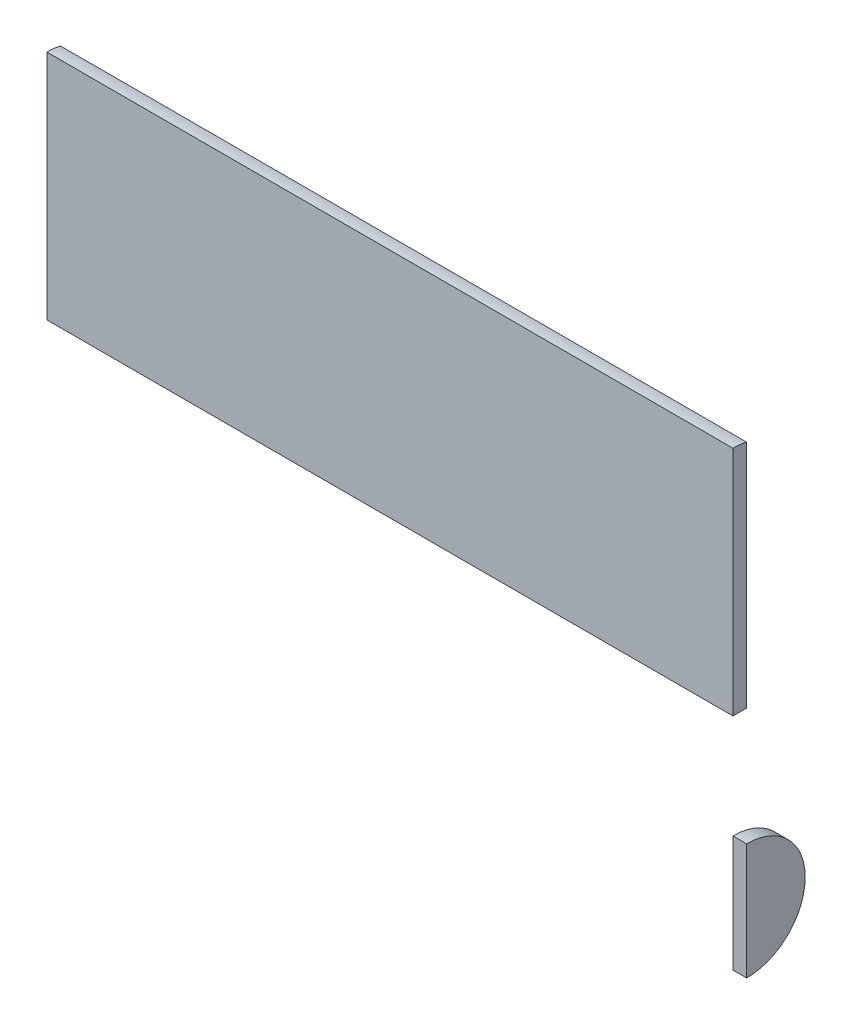
ISO-10303-21;
HEADER;
FILE_DESCRIPTION(('STEP AP214'),'2;1');
FILE_NAME('part.step','',(''),(''),'','','');
FILE_SCHEMA(('AUTOMOTIVE_DESIGN { 1 0 10303 214 1 1 1 1 }'));
ENDSEC;
DATA;
#1=APPLICATION_CONTEXT('core data for automotive mechanical design processes');
#2=APPLICATION_PROTOCOL_DEFINITION('international standard','automotive_design',2000,#1);
#3=PRODUCT_CONTEXT('',#1,'mechanical');
#4=PRODUCT('Part','Part','',(#3));
#5=PRODUCT_RELATED_PRODUCT_CATEGORY('part','',(#4));
#6=PRODUCT_DEFINITION_FORMATION('','',#4);
#7=PRODUCT_DEFINITION_CONTEXT('part definition',#1,'design');
#8=PRODUCT_DEFINITION('design','',#6,#7);
#9=PRODUCT_DEFINITION_SHAPE('','',#8);
#10=(LENGTH_UNIT() NAMED_UNIT(*) SI_UNIT(.MILLI.,.METRE.));
#11=(NAMED_UNIT(*) PLANE_ANGLE_UNIT() SI_UNIT($,.RADIAN.));
#12=(NAMED_UNIT(*) SI_UNIT($,.STERADIAN.) SOLID_ANGLE_UNIT());
#13=UNCERTAINTY_MEASURE_WITH_UNIT(LENGTH_MEASURE(1.E-05),#10,'distance_accuracy_value','');
#14=(GEOMETRIC_REPRESENTATION_CONTEXT(3) GLOBAL_UNCERTAINTY_ASSIGNED_CONTEXT((#13)) GLOBAL_UNIT_ASSIGNED_CONTEXT((#10,
#11,#12)) REPRESENTATION_CONTEXT('',''));
#15=CARTESIAN_POINT('',(0.,0.,0.));
#16=DIRECTION('',(0.,0.,1.));
#17=DIRECTION('',(1.,0.,0.));
#18=AXIS2_PLACEMENT_3D('',#15,#16,#17);
#19=CARTESIAN_POINT('',(-161.883839939593,44.0495020897818,76.0993116109301));
#20=DIRECTION('',(0.,0.,-1.));
#21=DIRECTION('',(-1.,0.,0.));
#22=AXIS2_PLACEMENT_3D('',#19,#20,#21);
#23=PLANE('',#22);
#24=DIRECTION('',(0.,1.,0.));
#25=VECTOR('',#24,1.);
#26=CARTESIAN_POINT('',(-11.8838399395931,44.0495020897818,76.0993116109301));
#27=LINE('',#26,#25);
#28=CARTESIAN_POINT('',(-11.8838399395931,44.0495020897818,76.0993116109301));
#29=VERTEX_POINT('',#28);
#30=CARTESIAN_POINT('',(-11.8838399395932,94.7495020897818,76.0993116109301));
#31=VERTEX_POINT('',#30);
#32=EDGE_CURVE('E108',#29,#31,#27,.T.);
#33=ORIENTED_EDGE('',*,*,#32,.T.);
#34=DIRECTION('',(1.,0.,0.));
#35=VECTOR('',#34,1.);
#36=CARTESIAN_POINT('',(-161.883839939593,94.7495020897818,76.0993116109301));
#37=LINE('',#36,#35);
#38=CARTESIAN_POINT('',(-161.883839939593,94.7495020897818,76.0993116109301));
#39=VERTEX_POINT('',#38);
#40=EDGE_CURVE('E12',#39,#31,#37,.T.);
#41=ORIENTED_EDGE('',*,*,#40,.F.);
#42=DIRECTION('',(0.,1.,0.));
#43=VECTOR('',#42,1.);
#44=CARTESIAN_POINT('',(-161.883839939593,44.0495020897818,76.0993116109301));
#45=LINE('',#44,#43);
#46=CARTESIAN_POINT('',(-161.883839939593,44.0495020897818,76.0993116109301));
#47=VERTEX_POINT('',#46);
#48=EDGE_CURVE('E96',#47,#39,#45,.T.);
#49=ORIENTED_EDGE('',*,*,#48,.F.);
#50=DIRECTION('',(1.,0.,0.));
#51=VECTOR('',#50,1.);
#52=CARTESIAN_POINT('',(-161.883839939593,44.0495020897818,76.0993116109301));
#53=LINE('',#52,#51);
#54=EDGE_CURVE('E104',#47,#29,#53,.T.);
#55=ORIENTED_EDGE('',*,*,#54,.T.);
#56=EDGE_LOOP('',(#33,#41,#49,#55));
#57=FACE_BOUND('',#56,.T.);
#58=ADVANCED_FACE('F45',(#57),#23,.F.);
#59=CARTESIAN_POINT('',(-161.883839939593,82.1324969686046,76.0842237859432));
#60=DIRECTION('',(1.,0.,0.));
#61=DIRECTION('',(0.,1.,0.));
#62=AXIS2_PLACEMENT_3D('',#59,#60,#61);
#63=CYLINDRICAL_SURFACE('',#62,12.6170141424298);
#64=CARTESIAN_POINT('',(-11.8838399395932,82.1324969686046,76.0842237859432));
#65=DIRECTION('',(-1.,0.,0.));
#66=DIRECTION('',(0.,-1.,0.));
#67=AXIS2_PLACEMENT_3D('',#64,#65,#66);
#68=CIRCLE('',#67,12.6170141424298);
#69=CARTESIAN_POINT('',(-11.8838399395932,94.3913445970619,73.0993116109301));
#70=VERTEX_POINT('',#69);
#71=EDGE_CURVE('E100',#31,#70,#68,.T.);
#72=ORIENTED_EDGE('',*,*,#71,.T.);
#73=DIRECTION('',(1.,0.,0.));
#74=VECTOR('',#73,1.);
#75=CARTESIAN_POINT('',(-161.883839939593,94.3913445970619,73.0993116109301));
#76=LINE('',#75,#74);
#77=CARTESIAN_POINT('',(-161.883839939593,94.3913445970619,73.0993116109301));
#78=VERTEX_POINT('',#77);
#79=EDGE_CURVE('E53',#78,#70,#76,.T.);
#80=ORIENTED_EDGE('',*,*,#79,.F.);
#81=CARTESIAN_POINT('',(-161.883839939593,82.1324969686046,76.0842237859432));
#82=DIRECTION('',(-1.,0.,0.));
#83=DIRECTION('',(0.,-1.,0.));
#84=AXIS2_PLACEMENT_3D('',#81,#82,#83);
#85=CIRCLE('',#84,12.6170141424298);
#86=EDGE_CURVE('E91',#39,#78,#85,.T.);
#87=ORIENTED_EDGE('',*,*,#86,.F.);
#88=ORIENTED_EDGE('',*,*,#40,.T.);
#89=EDGE_LOOP('',(#72,#80,#87,#88));
#90=FACE_BOUND('',#89,.T.);
#91=ADVANCED_FACE('F99',(#90),#63,.T.);
#92=CARTESIAN_POINT('',(-161.883839939593,44.0495020897818,73.0993116109301));
#93=DIRECTION('',(0.,0.,1.));
#94=DIRECTION('',(1.,0.,0.));
#95=AXIS2_PLACEMENT_3D('',#92,#93,#94);
#96=PLANE('',#95);
#97=DIRECTION('',(0.,-1.,0.));
#98=VECTOR('',#97,1.);
#99=CARTESIAN_POINT('',(-11.8838399395931,44.0495020897818,73.0993116109301));
#100=LINE('',#99,#98);
#101=CARTESIAN_POINT('',(-11.8838399395931,44.0495020897818,73.0993116109301));
#102=VERTEX_POINT('',#101);
#103=EDGE_CURVE('E78',#70,#102,#100,.T.);
#104=ORIENTED_EDGE('',*,*,#103,.T.);
#105=DIRECTION('',(1.,0.,0.));
#106=VECTOR('',#105,1.);
#107=CARTESIAN_POINT('',(-161.883839939593,44.0495020897818,73.0993116109301));
#108=LINE('',#107,#106);
#109=CARTESIAN_POINT('',(-161.883839939593,44.0495020897818,73.0993116109301));
#110=VERTEX_POINT('',#109);
#111=EDGE_CURVE('E101',#110,#102,#108,.T.);
#112=ORIENTED_EDGE('',*,*,#111,.F.);
#113=DIRECTION('',(0.,-1.,0.));
#114=VECTOR('',#113,1.);
#115=CARTESIAN_POINT('',(-161.883839939593,44.0495020897818,73.0993116109301));
#116=LINE('',#115,#114);
#117=EDGE_CURVE('E94',#78,#110,#116,.T.);
#118=ORIENTED_EDGE('',*,*,#117,.F.);
#119=ORIENTED_EDGE('',*,*,#79,.T.);
#120=EDGE_LOOP('',(#104,#112,#118,#119));
#121=FACE_BOUND('',#120,.T.);
#122=ADVANCED_FACE('F102',(#121),#96,.F.);
#123=CARTESIAN_POINT('',(-161.883839939593,44.0495020897818,76.0993116109301));
#124=DIRECTION('',(0.,1.,0.));
#125=DIRECTION('',(-1.,0.,0.));
#126=AXIS2_PLACEMENT_3D('',#123,#124,#125);
#127=PLANE('',#126);
#128=DIRECTION('',(0.,0.,1.));
#129=VECTOR('',#128,1.);
#130=CARTESIAN_POINT('',(-11.8838399395931,44.0495020897818,76.0993116109301));
#131=LINE('',#130,#129);
#132=EDGE_CURVE('E84',#102,#29,#131,.T.);
#133=ORIENTED_EDGE('',*,*,#132,.T.);
#134=ORIENTED_EDGE('',*,*,#54,.F.);
#135=DIRECTION('',(0.,0.,1.));
#136=VECTOR('',#135,1.);
#137=CARTESIAN_POINT('',(-161.883839939593,44.0495020897818,76.0993116109301));
#138=LINE('',#137,#136);
#139=EDGE_CURVE('E61',#110,#47,#138,.T.);
#140=ORIENTED_EDGE('',*,*,#139,.F.);
#141=ORIENTED_EDGE('',*,*,#111,.T.);
#142=EDGE_LOOP('',(#133,#134,#140,#141));
#143=FACE_BOUND('',#142,.T.);
#144=ADVANCED_FACE('F115',(#143),#127,.F.);
#145=CARTESIAN_POINT('',(-161.883839939593,82.1324969686046,76.0842237859432));
#146=DIRECTION('',(-1.,0.,0.));
#147=DIRECTION('',(0.,-1.,0.));
#148=AXIS2_PLACEMENT_3D('',#145,#146,#147);
#149=PLANE('',#148);
#150=ORIENTED_EDGE('',*,*,#48,.T.);
#151=ORIENTED_EDGE('',*,*,#86,.T.);
#152=ORIENTED_EDGE('',*,*,#117,.T.);
#153=ORIENTED_EDGE('',*,*,#139,.T.);
#154=EDGE_LOOP('',(#150,#151,#152,#153));
#155=FACE_BOUND('',#154,.T.);
#156=ADVANCED_FACE('F92',(#155),#149,.T.);
#157=CARTESIAN_POINT('',(-11.8838399395932,82.1324969686046,76.0842237859432));
#158=DIRECTION('',(-1.,0.,0.));
#159=DIRECTION('',(0.,-1.,0.));
#160=AXIS2_PLACEMENT_3D('',#157,#158,#159);
#161=PLANE('',#160);
#162=ORIENTED_EDGE('',*,*,#32,.F.);
#163=ORIENTED_EDGE('',*,*,#132,.F.);
#164=ORIENTED_EDGE('',*,*,#103,.F.);
#165=ORIENTED_EDGE('',*,*,#71,.F.);
#166=EDGE_LOOP('',(#162,#163,#164,#165));
#167=FACE_BOUND('',#166,.T.);
#168=ADVANCED_FACE('F118',(#167),#161,.F.);
#169=CLOSED_SHELL('',(#58,#91,#122,#144,#156,#168));
#170=MANIFOLD_SOLID_BREP('B2',#169);
#171=CARTESIAN_POINT('',(-11.8838399395931,0.,76.0993116109301));
#172=DIRECTION('',(0.,0.,1.));
#173=DIRECTION('',(0.,-1.,0.));
#174=AXIS2_PLACEMENT_3D('',#171,#172,#173);
#175=PLANE('',#174);
#176=DIRECTION('',(0.,-1.,0.));
#177=VECTOR('',#176,1.);
#178=CARTESIAN_POINT('',(-11.8838399395931,0.,76.0993116109301));
#179=LINE('',#178,#177);
#180=CARTESIAN_POINT('',(-11.8838399395931,21.3351432922939,76.0993116109301));
#181=VERTEX_POINT('',#180);
#182=CARTESIAN_POINT('',(-11.8838399395931,-4.05645986465814,76.0993116109301));
#183=VERTEX_POINT('',#182);
#184=EDGE_CURVE('E185',#181,#183,#179,.T.);
#185=ORIENTED_EDGE('',*,*,#184,.T.);
#186=DIRECTION('',(1.,0.,0.));
#187=VECTOR('',#186,1.);
#188=CARTESIAN_POINT('',(-11.8838399395931,-4.05645986465814,76.0993116109301));
#189=LINE('',#188,#187);
#190=CARTESIAN_POINT('',(-8.88383993959314,-4.05645986465814,76.0993116109301));
#191=VERTEX_POINT('',#190);
#192=EDGE_CURVE('E177',#183,#191,#189,.T.);
#193=ORIENTED_EDGE('',*,*,#192,.T.);
#194=DIRECTION('',(0.,-1.,0.));
#195=VECTOR('',#194,1.);
#196=CARTESIAN_POINT('',(-8.88383993959314,0.,76.0993116109301));
#197=LINE('',#196,#195);
#198=CARTESIAN_POINT('',(-8.88383993959315,21.3351432922939,76.0993116109301));
#199=VERTEX_POINT('',#198);
#200=EDGE_CURVE('E196',#199,#191,#197,.T.);
#201=ORIENTED_EDGE('',*,*,#200,.F.);
#202=DIRECTION('',(1.,0.,0.));
#203=VECTOR('',#202,1.);
#204=CARTESIAN_POINT('',(-11.8838399395931,21.3351432922939,76.0993116109301));
#205=LINE('',#204,#203);
#206=EDGE_CURVE('E43',#181,#199,#205,.T.);
#207=ORIENTED_EDGE('',*,*,#206,.F.);
#208=EDGE_LOOP('',(#185,#193,#201,#207));
#209=FACE_BOUND('',#208,.T.);
#210=ADVANCED_FACE('F169',(#209),#175,.T.);
#211=CARTESIAN_POINT('',(-11.8838399395931,8.63934171381789,76.));
#212=DIRECTION('',(1.,0.,0.));
#213=DIRECTION('',(0.,1.,0.));
#214=AXIS2_PLACEMENT_3D('',#211,#212,#213);
#215=CYLINDRICAL_SURFACE('',#214,12.69619);
#216=CARTESIAN_POINT('',(-8.88383993959315,8.63934171381789,76.));
#217=DIRECTION('',(-1.,0.,0.));
#218=DIRECTION('',(0.,-1.,0.));
#219=AXIS2_PLACEMENT_3D('',#216,#217,#218);
#220=CIRCLE('',#219,12.69619);
#221=EDGE_CURVE('E198',#199,#191,#220,.T.);
#222=ORIENTED_EDGE('',*,*,#221,.T.);
#223=ORIENTED_EDGE('',*,*,#192,.F.);
#224=CARTESIAN_POINT('',(-11.8838399395931,8.63934171381789,76.));
#225=DIRECTION('',(-1.,0.,0.));
#226=DIRECTION('',(0.,-1.,0.));
#227=AXIS2_PLACEMENT_3D('',#224,#225,#226);
#228=CIRCLE('',#227,12.69619);
#229=EDGE_CURVE('E201',#181,#183,#228,.T.);
#230=ORIENTED_EDGE('',*,*,#229,.F.);
#231=ORIENTED_EDGE('',*,*,#206,.T.);
#232=EDGE_LOOP('',(#222,#223,#230,#231));
#233=FACE_BOUND('',#232,.T.);
#234=ADVANCED_FACE('F202',(#233),#215,.T.);
#235=CARTESIAN_POINT('',(-11.8838399395931,0.,0.));
#236=DIRECTION('',(-1.,0.,0.));
#237=DIRECTION('',(0.,-1.,0.));
#238=AXIS2_PLACEMENT_3D('',#235,#236,#237);
#239=PLANE('',#238);
#240=ORIENTED_EDGE('',*,*,#229,.T.);
#241=ORIENTED_EDGE('',*,*,#184,.F.);
#242=EDGE_LOOP('',(#240,#241));
#243=FACE_BOUND('',#242,.T.);
#244=ADVANCED_FACE('F207',(#243),#239,.T.);
#245=CARTESIAN_POINT('',(-8.88383993959314,0.,0.));
#246=DIRECTION('',(-1.,0.,0.));
#247=DIRECTION('',(0.,-1.,0.));
#248=AXIS2_PLACEMENT_3D('',#245,#246,#247);
#249=PLANE('',#248);
#250=ORIENTED_EDGE('',*,*,#200,.T.);
#251=ORIENTED_EDGE('',*,*,#221,.F.);
#252=EDGE_LOOP('',(#250,#251));
#253=FACE_BOUND('',#252,.T.);
#254=ADVANCED_FACE('F197',(#253),#249,.F.);
#255=CLOSED_SHELL('',(#210,#234,#244,#254));
#256=MANIFOLD_SOLID_BREP('B6',#255);
#257=ADVANCED_BREP_SHAPE_REPRESENTATION('',(#18,#170,#256),#14);
#258=SHAPE_DEFINITION_REPRESENTATION(#9,#257);
ENDSEC;
END-ISO-10303-21;
